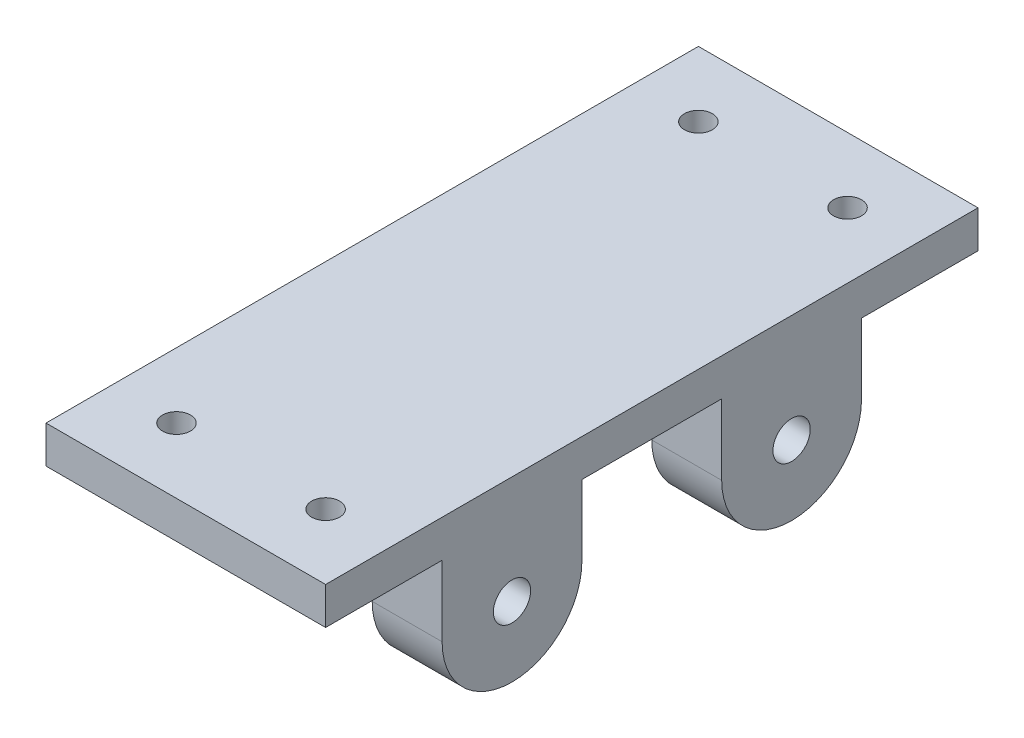
ISO-10303-21;
HEADER;
FILE_DESCRIPTION(('STEP AP214'),'2;1');
FILE_NAME('part.step','',(''),(''),'','','');
FILE_SCHEMA(('AUTOMOTIVE_DESIGN { 1 0 10303 214 1 1 1 1 }'));
ENDSEC;
DATA;
#1=APPLICATION_CONTEXT('core data for automotive mechanical design processes');
#2=APPLICATION_PROTOCOL_DEFINITION('international standard','automotive_design',2000,#1);
#3=PRODUCT_CONTEXT('',#1,'mechanical');
#4=PRODUCT('Part','Part','',(#3));
#5=PRODUCT_RELATED_PRODUCT_CATEGORY('part','',(#4));
#6=PRODUCT_DEFINITION_FORMATION('','',#4);
#7=PRODUCT_DEFINITION_CONTEXT('part definition',#1,'design');
#8=PRODUCT_DEFINITION('design','',#6,#7);
#9=PRODUCT_DEFINITION_SHAPE('','',#8);
#10=(LENGTH_UNIT() NAMED_UNIT(*) SI_UNIT(.MILLI.,.METRE.));
#11=(NAMED_UNIT(*) PLANE_ANGLE_UNIT() SI_UNIT($,.RADIAN.));
#12=(NAMED_UNIT(*) SI_UNIT($,.STERADIAN.) SOLID_ANGLE_UNIT());
#13=UNCERTAINTY_MEASURE_WITH_UNIT(LENGTH_MEASURE(1.E-05),#10,'distance_accuracy_value','');
#14=(GEOMETRIC_REPRESENTATION_CONTEXT(3) GLOBAL_UNCERTAINTY_ASSIGNED_CONTEXT((#13)) GLOBAL_UNIT_ASSIGNED_CONTEXT((#10,
#11,#12)) REPRESENTATION_CONTEXT('',''));
#15=CARTESIAN_POINT('',(0.,0.,0.));
#16=DIRECTION('',(0.,0.,1.));
#17=DIRECTION('',(1.,0.,0.));
#18=AXIS2_PLACEMENT_3D('',#15,#16,#17);
#19=CARTESIAN_POINT('',(-72.5298449772912,-15.1461061132681,-30.));
#20=DIRECTION('',(1.,0.,0.));
#21=DIRECTION('',(0.,0.,-1.));
#22=AXIS2_PLACEMENT_3D('',#19,#20,#21);
#23=CYLINDRICAL_SURFACE('',#22,15.);
#24=CARTESIAN_POINT('',(15.,-15.1461061132681,-30.));
#25=DIRECTION('',(1.,0.,0.));
#26=DIRECTION('',(0.,1.,0.));
#27=AXIS2_PLACEMENT_3D('',#24,#25,#26);
#28=CIRCLE('',#27,15.);
#29=CARTESIAN_POINT('',(15.,-15.1461061132681,-45.));
#30=VERTEX_POINT('',#29);
#31=CARTESIAN_POINT('',(15.,-15.1461061132681,-15.));
#32=VERTEX_POINT('',#31);
#33=EDGE_CURVE('E176',#30,#32,#28,.F.);
#34=ORIENTED_EDGE('',*,*,#33,.F.);
#35=DIRECTION('',(1.,0.,0.));
#36=VECTOR('',#35,1.);
#37=CARTESIAN_POINT('',(-72.5298449772912,-15.1461061132681,-45.));
#38=LINE('',#37,#36);
#39=CARTESIAN_POINT('',(30.,-15.1461061132681,-45.));
#40=VERTEX_POINT('',#39);
#41=EDGE_CURVE('E210',#30,#40,#38,.T.);
#42=ORIENTED_EDGE('',*,*,#41,.T.);
#43=CARTESIAN_POINT('',(30.,-15.1461061132681,-30.));
#44=DIRECTION('',(1.,0.,0.));
#45=DIRECTION('',(0.,0.,-1.));
#46=AXIS2_PLACEMENT_3D('',#43,#44,#45);
#47=CIRCLE('',#46,15.);
#48=CARTESIAN_POINT('',(30.,-15.1461061132681,-15.));
#49=VERTEX_POINT('',#48);
#50=EDGE_CURVE('E308',#49,#40,#47,.T.);
#51=ORIENTED_EDGE('',*,*,#50,.F.);
#52=DIRECTION('',(1.,0.,0.));
#53=VECTOR('',#52,1.);
#54=CARTESIAN_POINT('',(-72.5298449772912,-15.1461061132681,-15.));
#55=LINE('',#54,#53);
#56=EDGE_CURVE('E200',#32,#49,#55,.T.);
#57=ORIENTED_EDGE('',*,*,#56,.F.);
#58=EDGE_LOOP('',(#34,#42,#51,#57));
#59=FACE_BOUND('',#58,.T.);
#60=ADVANCED_FACE('F33',(#59),#23,.T.);
#61=CARTESIAN_POINT('',(-72.5298449772912,-15.1461061132681,-15.));
#62=DIRECTION('',(0.,0.,1.));
#63=DIRECTION('',(1.,0.,0.));
#64=AXIS2_PLACEMENT_3D('',#61,#62,#63);
#65=PLANE('',#64);
#66=DIRECTION('',(0.,-1.,0.));
#67=VECTOR('',#66,1.);
#68=CARTESIAN_POINT('',(-15.,-15.146106113268,-15.));
#69=LINE('',#68,#67);
#70=CARTESIAN_POINT('',(-15.,0.,-15.));
#71=VERTEX_POINT('',#70);
#72=CARTESIAN_POINT('',(-15.,-15.1461061132681,-15.));
#73=VERTEX_POINT('',#72);
#74=EDGE_CURVE('E287',#71,#73,#69,.T.);
#75=ORIENTED_EDGE('',*,*,#74,.F.);
#76=DIRECTION('',(1.,0.,0.));
#77=VECTOR('',#76,1.);
#78=CARTESIAN_POINT('',(-72.5298449772912,0.,-15.));
#79=LINE('',#78,#77);
#80=CARTESIAN_POINT('',(-30.,0.,-15.));
#81=VERTEX_POINT('',#80);
#82=EDGE_CURVE('E196',#81,#71,#79,.T.);
#83=ORIENTED_EDGE('',*,*,#82,.F.);
#84=DIRECTION('',(0.,1.,0.));
#85=VECTOR('',#84,1.);
#86=CARTESIAN_POINT('',(-30.,-15.1461061132681,-15.));
#87=LINE('',#86,#85);
#88=CARTESIAN_POINT('',(-30.,-15.1461061132681,-15.));
#89=VERTEX_POINT('',#88);
#90=EDGE_CURVE('E332',#89,#81,#87,.T.);
#91=ORIENTED_EDGE('',*,*,#90,.F.);
#92=EDGE_CURVE('E204',#89,#73,#55,.T.);
#93=ORIENTED_EDGE('',*,*,#92,.T.);
#94=EDGE_LOOP('',(#75,#83,#91,#93));
#95=FACE_BOUND('',#94,.T.);
#96=ADVANCED_FACE('F366',(#95),#65,.T.);
#97=CARTESIAN_POINT('',(-72.5298449772912,0.,-45.));
#98=DIRECTION('',(0.,0.,-1.));
#99=DIRECTION('',(-1.,0.,0.));
#100=AXIS2_PLACEMENT_3D('',#97,#98,#99);
#101=PLANE('',#100);
#102=DIRECTION('',(0.,1.,0.));
#103=VECTOR('',#102,1.);
#104=CARTESIAN_POINT('',(-15.,0.,-45.));
#105=LINE('',#104,#103);
#106=CARTESIAN_POINT('',(-15.,-15.1461061132681,-45.));
#107=VERTEX_POINT('',#106);
#108=CARTESIAN_POINT('',(-15.,0.,-45.));
#109=VERTEX_POINT('',#108);
#110=EDGE_CURVE('E283',#107,#109,#105,.T.);
#111=ORIENTED_EDGE('',*,*,#110,.F.);
#112=CARTESIAN_POINT('',(-30.,-15.1461061132681,-45.));
#113=VERTEX_POINT('',#112);
#114=EDGE_CURVE('E207',#113,#107,#38,.T.);
#115=ORIENTED_EDGE('',*,*,#114,.F.);
#116=DIRECTION('',(0.,-1.,0.));
#117=VECTOR('',#116,1.);
#118=CARTESIAN_POINT('',(-30.,0.,-45.));
#119=LINE('',#118,#117);
#120=CARTESIAN_POINT('',(-30.,0.,-45.));
#121=VERTEX_POINT('',#120);
#122=EDGE_CURVE('E211',#121,#113,#119,.T.);
#123=ORIENTED_EDGE('',*,*,#122,.F.);
#124=DIRECTION('',(1.,0.,0.));
#125=VECTOR('',#124,1.);
#126=CARTESIAN_POINT('',(-72.5298449772912,0.,-45.));
#127=LINE('',#126,#125);
#128=EDGE_CURVE('E197',#121,#109,#127,.T.);
#129=ORIENTED_EDGE('',*,*,#128,.T.);
#130=EDGE_LOOP('',(#111,#115,#123,#129));
#131=FACE_BOUND('',#130,.T.);
#132=ADVANCED_FACE('F372',(#131),#101,.T.);
#133=CARTESIAN_POINT('',(-72.5298449772912,-15.1461061132681,15.));
#134=DIRECTION('',(0.,0.,1.));
#135=DIRECTION('',(1.,0.,0.));
#136=AXIS2_PLACEMENT_3D('',#133,#134,#135);
#137=PLANE('',#136);
#138=DIRECTION('',(1.,0.,0.));
#139=VECTOR('',#138,1.);
#140=CARTESIAN_POINT('',(-72.5298449772912,0.,15.));
#141=LINE('',#140,#139);
#142=CARTESIAN_POINT('',(-30.,0.,15.));
#143=VERTEX_POINT('',#142);
#144=CARTESIAN_POINT('',(-15.,0.,15.));
#145=VERTEX_POINT('',#144);
#146=EDGE_CURVE('E324',#143,#145,#141,.T.);
#147=ORIENTED_EDGE('',*,*,#146,.T.);
#148=DIRECTION('',(0.,-1.,0.));
#149=VECTOR('',#148,1.);
#150=CARTESIAN_POINT('',(-15.,-15.146106113268,15.));
#151=LINE('',#150,#149);
#152=CARTESIAN_POINT('',(-15.,-15.1461061132681,15.));
#153=VERTEX_POINT('',#152);
#154=EDGE_CURVE('E280',#145,#153,#151,.T.);
#155=ORIENTED_EDGE('',*,*,#154,.T.);
#156=DIRECTION('',(1.,0.,0.));
#157=VECTOR('',#156,1.);
#158=CARTESIAN_POINT('',(-72.5298449772912,-15.1461061132681,15.));
#159=LINE('',#158,#157);
#160=CARTESIAN_POINT('',(-30.,-15.1461061132681,15.));
#161=VERTEX_POINT('',#160);
#162=EDGE_CURVE('E328',#161,#153,#159,.T.);
#163=ORIENTED_EDGE('',*,*,#162,.F.);
#164=DIRECTION('',(0.,1.,0.));
#165=VECTOR('',#164,1.);
#166=CARTESIAN_POINT('',(-30.,-15.1461061132681,15.));
#167=LINE('',#166,#165);
#168=EDGE_CURVE('E305',#161,#143,#167,.T.);
#169=ORIENTED_EDGE('',*,*,#168,.T.);
#170=EDGE_LOOP('',(#147,#155,#163,#169));
#171=FACE_BOUND('',#170,.T.);
#172=ADVANCED_FACE('F438',(#171),#137,.F.);
#173=CARTESIAN_POINT('',(-72.5298449772912,0.,45.));
#174=DIRECTION('',(0.,0.,-1.));
#175=DIRECTION('',(-1.,0.,0.));
#176=AXIS2_PLACEMENT_3D('',#173,#174,#175);
#177=PLANE('',#176);
#178=DIRECTION('',(1.,0.,0.));
#179=VECTOR('',#178,1.);
#180=CARTESIAN_POINT('',(-72.5298449772912,-15.1461061132681,45.));
#181=LINE('',#180,#179);
#182=CARTESIAN_POINT('',(-30.,-15.1461061132681,45.));
#183=VERTEX_POINT('',#182);
#184=CARTESIAN_POINT('',(-15.,-15.1461061132681,45.));
#185=VERTEX_POINT('',#184);
#186=EDGE_CURVE('E318',#183,#185,#181,.T.);
#187=ORIENTED_EDGE('',*,*,#186,.T.);
#188=DIRECTION('',(0.,1.,0.));
#189=VECTOR('',#188,1.);
#190=CARTESIAN_POINT('',(-15.,0.,45.));
#191=LINE('',#190,#189);
#192=CARTESIAN_POINT('',(-15.,0.,45.));
#193=VERTEX_POINT('',#192);
#194=EDGE_CURVE('E278',#185,#193,#191,.T.);
#195=ORIENTED_EDGE('',*,*,#194,.T.);
#196=DIRECTION('',(1.,0.,0.));
#197=VECTOR('',#196,1.);
#198=CARTESIAN_POINT('',(-72.5298449772912,0.,45.));
#199=LINE('',#198,#197);
#200=CARTESIAN_POINT('',(-30.,0.,45.));
#201=VERTEX_POINT('',#200);
#202=EDGE_CURVE('E58',#201,#193,#199,.T.);
#203=ORIENTED_EDGE('',*,*,#202,.F.);
#204=DIRECTION('',(0.,-1.,0.));
#205=VECTOR('',#204,1.);
#206=CARTESIAN_POINT('',(-30.,0.,45.));
#207=LINE('',#206,#205);
#208=EDGE_CURVE('E302',#201,#183,#207,.T.);
#209=ORIENTED_EDGE('',*,*,#208,.T.);
#210=EDGE_LOOP('',(#187,#195,#203,#209));
#211=FACE_BOUND('',#210,.T.);
#212=ADVANCED_FACE('F429',(#211),#177,.F.);
#213=CARTESIAN_POINT('',(-72.5298449772912,-15.1461061132681,30.));
#214=DIRECTION('',(1.,0.,0.));
#215=DIRECTION('',(0.,0.,-1.));
#216=AXIS2_PLACEMENT_3D('',#213,#214,#215);
#217=CYLINDRICAL_SURFACE('',#216,15.);
#218=CARTESIAN_POINT('',(15.,-15.1461061132681,45.));
#219=VERTEX_POINT('',#218);
#220=CARTESIAN_POINT('',(30.,-15.1461061132681,45.));
#221=VERTEX_POINT('',#220);
#222=EDGE_CURVE('E321',#219,#221,#181,.T.);
#223=ORIENTED_EDGE('',*,*,#222,.F.);
#224=CARTESIAN_POINT('',(15.,-15.1461061132681,30.));
#225=DIRECTION('',(1.,0.,0.));
#226=DIRECTION('',(0.,1.,0.));
#227=AXIS2_PLACEMENT_3D('',#224,#225,#226);
#228=CIRCLE('',#227,15.);
#229=CARTESIAN_POINT('',(15.,-15.1461061132681,15.));
#230=VERTEX_POINT('',#229);
#231=EDGE_CURVE('E251',#219,#230,#228,.T.);
#232=ORIENTED_EDGE('',*,*,#231,.T.);
#233=CARTESIAN_POINT('',(30.,-15.1461061132681,15.));
#234=VERTEX_POINT('',#233);
#235=EDGE_CURVE('E317',#230,#234,#159,.T.);
#236=ORIENTED_EDGE('',*,*,#235,.T.);
#237=CARTESIAN_POINT('',(30.,-15.1461061132681,30.));
#238=DIRECTION('',(-1.,0.,0.));
#239=DIRECTION('',(0.,0.,1.));
#240=AXIS2_PLACEMENT_3D('',#237,#238,#239);
#241=CIRCLE('',#240,15.);
#242=EDGE_CURVE('E297',#234,#221,#241,.T.);
#243=ORIENTED_EDGE('',*,*,#242,.T.);
#244=EDGE_LOOP('',(#223,#232,#236,#243));
#245=FACE_BOUND('',#244,.T.);
#246=ADVANCED_FACE('F418',(#245),#217,.T.);
#247=CARTESIAN_POINT('',(-30.001,-15.1461061132681,30.));
#248=DIRECTION('',(1.,0.,0.));
#249=DIRECTION('',(0.,0.,-1.));
#250=AXIS2_PLACEMENT_3D('',#247,#248,#249);
#251=CYLINDRICAL_SURFACE('',#250,4.00000000000001);
#252=CARTESIAN_POINT('',(-15.,-15.1461061132681,30.));
#253=DIRECTION('',(-1.,0.,0.));
#254=DIRECTION('',(0.,-1.,0.));
#255=AXIS2_PLACEMENT_3D('',#252,#253,#254);
#256=CIRCLE('',#255,4.00000000000001);
#257=CARTESIAN_POINT('',(-15.,-19.1461061132681,30.));
#258=VERTEX_POINT('',#257);
#259=EDGE_CURVE('E273',#258,#258,#256,.F.);
#260=ORIENTED_EDGE('',*,*,#259,.T.);
#261=EDGE_LOOP('',(#260));
#262=FACE_BOUND('',#261,.T.);
#263=CARTESIAN_POINT('',(-30.,-15.1461061132681,30.));
#264=DIRECTION('',(1.,0.,0.));
#265=DIRECTION('',(0.,0.,-1.));
#266=AXIS2_PLACEMENT_3D('',#263,#264,#265);
#267=CIRCLE('',#266,4.00000000000001);
#268=CARTESIAN_POINT('',(-30.,-15.1461061132681,26.));
#269=VERTEX_POINT('',#268);
#270=EDGE_CURVE('E294',#269,#269,#267,.F.);
#271=ORIENTED_EDGE('',*,*,#270,.T.);
#272=EDGE_LOOP('',(#271));
#273=FACE_BOUND('',#272,.T.);
#274=ADVANCED_FACE('F359',(#262,#273),#251,.F.);
#275=CARTESIAN_POINT('',(-30.001,-15.1461061132681,-30.));
#276=DIRECTION('',(1.,0.,0.));
#277=DIRECTION('',(0.,0.,-1.));
#278=AXIS2_PLACEMENT_3D('',#275,#276,#277);
#279=CYLINDRICAL_SURFACE('',#278,3.99999999999999);
#280=CARTESIAN_POINT('',(-15.,-15.1461061132681,-30.));
#281=DIRECTION('',(-1.,0.,0.));
#282=DIRECTION('',(0.,-1.,0.));
#283=AXIS2_PLACEMENT_3D('',#280,#281,#282);
#284=CIRCLE('',#283,3.99999999999999);
#285=CARTESIAN_POINT('',(-15.,-19.146106113268,-30.));
#286=VERTEX_POINT('',#285);
#287=EDGE_CURVE('E37',#286,#286,#284,.F.);
#288=ORIENTED_EDGE('',*,*,#287,.T.);
#289=EDGE_LOOP('',(#288));
#290=FACE_BOUND('',#289,.T.);
#291=CARTESIAN_POINT('',(-30.,-15.1461061132681,-30.));
#292=DIRECTION('',(1.,0.,0.));
#293=DIRECTION('',(0.,0.,-1.));
#294=AXIS2_PLACEMENT_3D('',#291,#292,#293);
#295=CIRCLE('',#294,3.99999999999999);
#296=CARTESIAN_POINT('',(-30.,-15.1461061132681,-34.));
#297=VERTEX_POINT('',#296);
#298=EDGE_CURVE('E293',#297,#297,#295,.F.);
#299=ORIENTED_EDGE('',*,*,#298,.T.);
#300=EDGE_LOOP('',(#299));
#301=FACE_BOUND('',#300,.T.);
#302=ADVANCED_FACE('F351',(#290,#301),#279,.F.);
#303=CARTESIAN_POINT('',(30.,8.,70.));
#304=DIRECTION('',(-1.,0.,0.));
#305=DIRECTION('',(0.,0.,1.));
#306=AXIS2_PLACEMENT_3D('',#303,#304,#305);
#307=PLANE('',#306);
#308=CARTESIAN_POINT('',(30.,-15.1461061132681,-30.));
#309=DIRECTION('',(1.,0.,0.));
#310=DIRECTION('',(0.,0.,-1.));
#311=AXIS2_PLACEMENT_3D('',#308,#309,#310);
#312=CIRCLE('',#311,3.99999999999999);
#313=CARTESIAN_POINT('',(30.,-15.1461061132681,-34.));
#314=VERTEX_POINT('',#313);
#315=EDGE_CURVE('E290',#314,#314,#312,.T.);
#316=ORIENTED_EDGE('',*,*,#315,.F.);
#317=EDGE_LOOP('',(#316));
#318=FACE_BOUND('',#317,.T.);
#319=CARTESIAN_POINT('',(30.,-15.1461061132681,30.));
#320=DIRECTION('',(1.,0.,0.));
#321=DIRECTION('',(0.,0.,-1.));
#322=AXIS2_PLACEMENT_3D('',#319,#320,#321);
#323=CIRCLE('',#322,4.00000000000001);
#324=CARTESIAN_POINT('',(30.,-15.1461061132681,26.));
#325=VERTEX_POINT('',#324);
#326=EDGE_CURVE('E289',#325,#325,#323,.T.);
#327=ORIENTED_EDGE('',*,*,#326,.F.);
#328=EDGE_LOOP('',(#327));
#329=FACE_BOUND('',#328,.T.);
#330=DIRECTION('',(0.,0.,-1.));
#331=VECTOR('',#330,1.);
#332=CARTESIAN_POINT('',(30.,0.,70.));
#333=LINE('',#332,#331);
#334=CARTESIAN_POINT('',(30.,0.,70.));
#335=VERTEX_POINT('',#334);
#336=CARTESIAN_POINT('',(30.,0.,45.));
#337=VERTEX_POINT('',#336);
#338=EDGE_CURVE('E226',#335,#337,#333,.T.);
#339=ORIENTED_EDGE('',*,*,#338,.T.);
#340=DIRECTION('',(0.,1.,0.));
#341=VECTOR('',#340,1.);
#342=CARTESIAN_POINT('',(30.,0.,45.));
#343=LINE('',#342,#341);
#344=EDGE_CURVE('E314',#221,#337,#343,.T.);
#345=ORIENTED_EDGE('',*,*,#344,.F.);
#346=ORIENTED_EDGE('',*,*,#242,.F.);
#347=DIRECTION('',(0.,-1.,0.));
#348=VECTOR('',#347,1.);
#349=CARTESIAN_POINT('',(30.,-15.1461061132681,15.));
#350=LINE('',#349,#348);
#351=CARTESIAN_POINT('',(30.,0.,15.));
#352=VERTEX_POINT('',#351);
#353=EDGE_CURVE('E311',#352,#234,#350,.T.);
#354=ORIENTED_EDGE('',*,*,#353,.F.);
#355=CARTESIAN_POINT('',(30.,0.,-15.));
#356=VERTEX_POINT('',#355);
#357=EDGE_CURVE('E230',#352,#356,#333,.T.);
#358=ORIENTED_EDGE('',*,*,#357,.T.);
#359=DIRECTION('',(0.,-1.,0.));
#360=VECTOR('',#359,1.);
#361=CARTESIAN_POINT('',(30.,-15.1461061132681,-15.));
#362=LINE('',#361,#360);
#363=EDGE_CURVE('E195',#356,#49,#362,.T.);
#364=ORIENTED_EDGE('',*,*,#363,.T.);
#365=ORIENTED_EDGE('',*,*,#50,.T.);
#366=DIRECTION('',(0.,1.,0.));
#367=VECTOR('',#366,1.);
#368=CARTESIAN_POINT('',(30.,0.,-45.));
#369=LINE('',#368,#367);
#370=CARTESIAN_POINT('',(30.,0.,-45.));
#371=VERTEX_POINT('',#370);
#372=EDGE_CURVE('E338',#40,#371,#369,.T.);
#373=ORIENTED_EDGE('',*,*,#372,.T.);
#374=CARTESIAN_POINT('',(30.,0.,-70.));
#375=VERTEX_POINT('',#374);
#376=EDGE_CURVE('E213',#371,#375,#333,.T.);
#377=ORIENTED_EDGE('',*,*,#376,.T.);
#378=DIRECTION('',(0.,-1.,0.));
#379=VECTOR('',#378,1.);
#380=CARTESIAN_POINT('',(30.,8.,-70.));
#381=LINE('',#380,#379);
#382=CARTESIAN_POINT('',(30.,8.,-70.));
#383=VERTEX_POINT('',#382);
#384=EDGE_CURVE('E11',#383,#375,#381,.T.);
#385=ORIENTED_EDGE('',*,*,#384,.F.);
#386=DIRECTION('',(0.,0.,-1.));
#387=VECTOR('',#386,1.);
#388=CARTESIAN_POINT('',(30.,8.,70.));
#389=LINE('',#388,#387);
#390=CARTESIAN_POINT('',(30.,8.,70.));
#391=VERTEX_POINT('',#390);
#392=EDGE_CURVE('E215',#391,#383,#389,.T.);
#393=ORIENTED_EDGE('',*,*,#392,.F.);
#394=DIRECTION('',(0.,-1.,0.));
#395=VECTOR('',#394,1.);
#396=CARTESIAN_POINT('',(30.,8.,70.));
#397=LINE('',#396,#395);
#398=EDGE_CURVE('E225',#391,#335,#397,.T.);
#399=ORIENTED_EDGE('',*,*,#398,.T.);
#400=EDGE_LOOP('',(#339,#345,#346,#354,#358,#364,#365,#373,#377,#385,#393,#399));
#401=FACE_BOUND('',#400,.T.);
#402=ADVANCED_FACE('F35',(#318,#329,#401),#307,.F.);
#403=CARTESIAN_POINT('',(-30.,8.,-70.));
#404=DIRECTION('',(0.,0.,1.));
#405=DIRECTION('',(1.,0.,0.));
#406=AXIS2_PLACEMENT_3D('',#403,#404,#405);
#407=PLANE('',#406);
#408=DIRECTION('',(-1.,0.,0.));
#409=VECTOR('',#408,1.);
#410=CARTESIAN_POINT('',(-30.,0.,-70.));
#411=LINE('',#410,#409);
#412=CARTESIAN_POINT('',(-30.,0.,-70.));
#413=VERTEX_POINT('',#412);
#414=EDGE_CURVE('E229',#375,#413,#411,.T.);
#415=ORIENTED_EDGE('',*,*,#414,.T.);
#416=DIRECTION('',(0.,-1.,0.));
#417=VECTOR('',#416,1.);
#418=CARTESIAN_POINT('',(-30.,8.,-70.));
#419=LINE('',#418,#417);
#420=CARTESIAN_POINT('',(-30.,8.,-70.));
#421=VERTEX_POINT('',#420);
#422=EDGE_CURVE('E42',#421,#413,#419,.T.);
#423=ORIENTED_EDGE('',*,*,#422,.F.);
#424=DIRECTION('',(-1.,0.,0.));
#425=VECTOR('',#424,1.);
#426=CARTESIAN_POINT('',(-30.,8.,-70.));
#427=LINE('',#426,#425);
#428=EDGE_CURVE('E218',#383,#421,#427,.T.);
#429=ORIENTED_EDGE('',*,*,#428,.F.);
#430=ORIENTED_EDGE('',*,*,#384,.T.);
#431=EDGE_LOOP('',(#415,#423,#429,#430));
#432=FACE_BOUND('',#431,.T.);
#433=ADVANCED_FACE('F350',(#432),#407,.F.);
#434=CARTESIAN_POINT('',(-30.,8.,70.));
#435=DIRECTION('',(1.,0.,0.));
#436=DIRECTION('',(0.,0.,-1.));
#437=AXIS2_PLACEMENT_3D('',#434,#435,#436);
#438=PLANE('',#437);
#439=ORIENTED_EDGE('',*,*,#298,.F.);
#440=EDGE_LOOP('',(#439));
#441=FACE_BOUND('',#440,.T.);
#442=ORIENTED_EDGE('',*,*,#270,.F.);
#443=EDGE_LOOP('',(#442));
#444=FACE_BOUND('',#443,.T.);
#445=DIRECTION('',(0.,0.,1.));
#446=VECTOR('',#445,1.);
#447=CARTESIAN_POINT('',(-30.,0.,70.));
#448=LINE('',#447,#446);
#449=EDGE_CURVE('E233',#413,#121,#448,.T.);
#450=ORIENTED_EDGE('',*,*,#449,.T.);
#451=ORIENTED_EDGE('',*,*,#122,.T.);
#452=CARTESIAN_POINT('',(-30.,-15.1461061132681,-30.));
#453=DIRECTION('',(1.,0.,0.));
#454=DIRECTION('',(0.,0.,-1.));
#455=AXIS2_PLACEMENT_3D('',#452,#453,#454);
#456=CIRCLE('',#455,15.);
#457=EDGE_CURVE('E214',#113,#89,#456,.F.);
#458=ORIENTED_EDGE('',*,*,#457,.T.);
#459=ORIENTED_EDGE('',*,*,#90,.T.);
#460=EDGE_CURVE('E236',#81,#143,#448,.T.);
#461=ORIENTED_EDGE('',*,*,#460,.T.);
#462=ORIENTED_EDGE('',*,*,#168,.F.);
#463=CARTESIAN_POINT('',(-30.,-15.1461061132681,30.));
#464=DIRECTION('',(1.,0.,0.));
#465=DIRECTION('',(0.,0.,-1.));
#466=AXIS2_PLACEMENT_3D('',#463,#464,#465);
#467=CIRCLE('',#466,15.);
#468=EDGE_CURVE('E304',#183,#161,#467,.T.);
#469=ORIENTED_EDGE('',*,*,#468,.F.);
#470=ORIENTED_EDGE('',*,*,#208,.F.);
#471=CARTESIAN_POINT('',(-30.,0.,70.));
#472=VERTEX_POINT('',#471);
#473=EDGE_CURVE('E232',#201,#472,#448,.T.);
#474=ORIENTED_EDGE('',*,*,#473,.T.);
#475=DIRECTION('',(0.,-1.,0.));
#476=VECTOR('',#475,1.);
#477=CARTESIAN_POINT('',(-30.,8.,70.));
#478=LINE('',#477,#476);
#479=CARTESIAN_POINT('',(-30.,8.,70.));
#480=VERTEX_POINT('',#479);
#481=EDGE_CURVE('E240',#480,#472,#478,.T.);
#482=ORIENTED_EDGE('',*,*,#481,.F.);
#483=DIRECTION('',(0.,0.,1.));
#484=VECTOR('',#483,1.);
#485=CARTESIAN_POINT('',(-30.,8.,70.));
#486=LINE('',#485,#484);
#487=EDGE_CURVE('E221',#421,#480,#486,.T.);
#488=ORIENTED_EDGE('',*,*,#487,.F.);
#489=ORIENTED_EDGE('',*,*,#422,.T.);
#490=EDGE_LOOP('',(#450,#451,#458,#459,#461,#462,#469,#470,#474,#482,#488,#489));
#491=FACE_BOUND('',#490,.T.);
#492=ADVANCED_FACE('F357',(#441,#444,#491),#438,.F.);
#493=CARTESIAN_POINT('',(-30.,8.,70.));
#494=DIRECTION('',(0.,0.,-1.));
#495=DIRECTION('',(-1.,0.,0.));
#496=AXIS2_PLACEMENT_3D('',#493,#494,#495);
#497=PLANE('',#496);
#498=DIRECTION('',(1.,0.,0.));
#499=VECTOR('',#498,1.);
#500=CARTESIAN_POINT('',(-30.,0.,70.));
#501=LINE('',#500,#499);
#502=EDGE_CURVE('E219',#472,#335,#501,.T.);
#503=ORIENTED_EDGE('',*,*,#502,.T.);
#504=ORIENTED_EDGE('',*,*,#398,.F.);
#505=DIRECTION('',(1.,0.,0.));
#506=VECTOR('',#505,1.);
#507=CARTESIAN_POINT('',(-30.,8.,70.));
#508=LINE('',#507,#506);
#509=EDGE_CURVE('E223',#480,#391,#508,.T.);
#510=ORIENTED_EDGE('',*,*,#509,.F.);
#511=ORIENTED_EDGE('',*,*,#481,.T.);
#512=EDGE_LOOP('',(#503,#504,#510,#511));
#513=FACE_BOUND('',#512,.T.);
#514=ADVANCED_FACE('F425',(#513),#497,.F.);
#515=CARTESIAN_POINT('',(0.,8.,0.));
#516=DIRECTION('',(0.,-1.,0.));
#517=DIRECTION('',(0.,0.,-1.));
#518=AXIS2_PLACEMENT_3D('',#515,#516,#517);
#519=PLANE('',#518);
#520=CARTESIAN_POINT('',(16.,8.,-56.));
#521=DIRECTION('',(0.,-1.,0.));
#522=DIRECTION('',(0.,0.,-1.));
#523=AXIS2_PLACEMENT_3D('',#520,#521,#522);
#524=CIRCLE('',#523,3.);
#525=CARTESIAN_POINT('',(16.,8.,-59.));
#526=VERTEX_POINT('',#525);
#527=EDGE_CURVE('E258',#526,#526,#524,.T.);
#528=ORIENTED_EDGE('',*,*,#527,.T.);
#529=EDGE_LOOP('',(#528));
#530=FACE_BOUND('',#529,.T.);
#531=CARTESIAN_POINT('',(16.,8.,56.));
#532=DIRECTION('',(0.,-1.,0.));
#533=DIRECTION('',(0.,0.,-1.));
#534=AXIS2_PLACEMENT_3D('',#531,#532,#533);
#535=CIRCLE('',#534,3.);
#536=CARTESIAN_POINT('',(16.,8.,53.));
#537=VERTEX_POINT('',#536);
#538=EDGE_CURVE('E502',#537,#537,#535,.T.);
#539=ORIENTED_EDGE('',*,*,#538,.T.);
#540=EDGE_LOOP('',(#539));
#541=FACE_BOUND('',#540,.T.);
#542=CARTESIAN_POINT('',(-16.,8.,56.));
#543=DIRECTION('',(0.,-1.,0.));
#544=DIRECTION('',(0.,0.,-1.));
#545=AXIS2_PLACEMENT_3D('',#542,#543,#544);
#546=CIRCLE('',#545,3.);
#547=CARTESIAN_POINT('',(-16.,8.,53.));
#548=VERTEX_POINT('',#547);
#549=EDGE_CURVE('E500',#548,#548,#546,.T.);
#550=ORIENTED_EDGE('',*,*,#549,.T.);
#551=EDGE_LOOP('',(#550));
#552=FACE_BOUND('',#551,.T.);
#553=CARTESIAN_POINT('',(-16.,8.,-56.));
#554=DIRECTION('',(0.,-1.,0.));
#555=DIRECTION('',(0.,0.,-1.));
#556=AXIS2_PLACEMENT_3D('',#553,#554,#555);
#557=CIRCLE('',#556,3.);
#558=CARTESIAN_POINT('',(-16.,8.,-59.));
#559=VERTEX_POINT('',#558);
#560=EDGE_CURVE('E503',#559,#559,#557,.T.);
#561=ORIENTED_EDGE('',*,*,#560,.T.);
#562=EDGE_LOOP('',(#561));
#563=FACE_BOUND('',#562,.T.);
#564=ORIENTED_EDGE('',*,*,#392,.T.);
#565=ORIENTED_EDGE('',*,*,#428,.T.);
#566=ORIENTED_EDGE('',*,*,#487,.T.);
#567=ORIENTED_EDGE('',*,*,#509,.T.);
#568=EDGE_LOOP('',(#564,#565,#566,#567));
#569=FACE_BOUND('',#568,.T.);
#570=ADVANCED_FACE('F383',(#530,#541,#552,#563,#569),#519,.F.);
#571=CARTESIAN_POINT('',(0.,0.,0.));
#572=DIRECTION('',(0.,-1.,0.));
#573=DIRECTION('',(0.,0.,-1.));
#574=AXIS2_PLACEMENT_3D('',#571,#572,#573);
#575=PLANE('',#574);
#576=CARTESIAN_POINT('',(16.,0.,-56.));
#577=DIRECTION('',(0.,-1.,0.));
#578=DIRECTION('',(0.,0.,1.));
#579=AXIS2_PLACEMENT_3D('',#576,#577,#578);
#580=CIRCLE('',#579,3.);
#581=CARTESIAN_POINT('',(16.,0.,-53.));
#582=VERTEX_POINT('',#581);
#583=EDGE_CURVE('E512',#582,#582,#580,.T.);
#584=ORIENTED_EDGE('',*,*,#583,.F.);
#585=EDGE_LOOP('',(#584));
#586=FACE_BOUND('',#585,.T.);
#587=CARTESIAN_POINT('',(16.,0.,56.));
#588=DIRECTION('',(0.,-1.,0.));
#589=DIRECTION('',(0.,0.,-1.));
#590=AXIS2_PLACEMENT_3D('',#587,#588,#589);
#591=CIRCLE('',#590,3.);
#592=CARTESIAN_POINT('',(16.,0.,53.));
#593=VERTEX_POINT('',#592);
#594=EDGE_CURVE('E515',#593,#593,#591,.T.);
#595=ORIENTED_EDGE('',*,*,#594,.F.);
#596=EDGE_LOOP('',(#595));
#597=FACE_BOUND('',#596,.T.);
#598=CARTESIAN_POINT('',(-16.,0.,56.));
#599=DIRECTION('',(0.,-1.,0.));
#600=DIRECTION('',(0.,0.,1.));
#601=AXIS2_PLACEMENT_3D('',#598,#599,#600);
#602=CIRCLE('',#601,3.);
#603=CARTESIAN_POINT('',(-16.,0.,59.));
#604=VERTEX_POINT('',#603);
#605=EDGE_CURVE('E497',#604,#604,#602,.T.);
#606=ORIENTED_EDGE('',*,*,#605,.F.);
#607=EDGE_LOOP('',(#606));
#608=FACE_BOUND('',#607,.T.);
#609=CARTESIAN_POINT('',(-16.,0.,-56.));
#610=DIRECTION('',(0.,-1.,0.));
#611=DIRECTION('',(0.,0.,-1.));
#612=AXIS2_PLACEMENT_3D('',#609,#610,#611);
#613=CIRCLE('',#612,3.);
#614=CARTESIAN_POINT('',(-16.,0.,-59.));
#615=VERTEX_POINT('',#614);
#616=EDGE_CURVE('E507',#615,#615,#613,.T.);
#617=ORIENTED_EDGE('',*,*,#616,.F.);
#618=EDGE_LOOP('',(#617));
#619=FACE_BOUND('',#618,.T.);
#620=CARTESIAN_POINT('',(15.,0.,-45.));
#621=VERTEX_POINT('',#620);
#622=EDGE_CURVE('E188',#621,#371,#127,.T.);
#623=ORIENTED_EDGE('',*,*,#622,.F.);
#624=DIRECTION('',(0.,0.,1.));
#625=VECTOR('',#624,1.);
#626=CARTESIAN_POINT('',(15.,0.,-70.));
#627=LINE('',#626,#625);
#628=CARTESIAN_POINT('',(15.,0.,-15.));
#629=VERTEX_POINT('',#628);
#630=EDGE_CURVE('E50',#621,#629,#627,.T.);
#631=ORIENTED_EDGE('',*,*,#630,.T.);
#632=EDGE_CURVE('E185',#629,#356,#79,.T.);
#633=ORIENTED_EDGE('',*,*,#632,.T.);
#634=ORIENTED_EDGE('',*,*,#357,.F.);
#635=CARTESIAN_POINT('',(15.,0.,15.));
#636=VERTEX_POINT('',#635);
#637=EDGE_CURVE('E327',#636,#352,#141,.T.);
#638=ORIENTED_EDGE('',*,*,#637,.F.);
#639=CARTESIAN_POINT('',(15.,0.,45.));
#640=VERTEX_POINT('',#639);
#641=EDGE_CURVE('E190',#636,#640,#627,.T.);
#642=ORIENTED_EDGE('',*,*,#641,.T.);
#643=EDGE_CURVE('E323',#640,#337,#199,.T.);
#644=ORIENTED_EDGE('',*,*,#643,.T.);
#645=ORIENTED_EDGE('',*,*,#338,.F.);
#646=ORIENTED_EDGE('',*,*,#502,.F.);
#647=ORIENTED_EDGE('',*,*,#473,.F.);
#648=ORIENTED_EDGE('',*,*,#202,.T.);
#649=DIRECTION('',(0.,0.,1.));
#650=VECTOR('',#649,1.);
#651=CARTESIAN_POINT('',(-15.,0.,-70.));
#652=LINE('',#651,#650);
#653=EDGE_CURVE('E189',#145,#193,#652,.T.);
#654=ORIENTED_EDGE('',*,*,#653,.F.);
#655=ORIENTED_EDGE('',*,*,#146,.F.);
#656=ORIENTED_EDGE('',*,*,#460,.F.);
#657=ORIENTED_EDGE('',*,*,#82,.T.);
#658=EDGE_CURVE('E247',#109,#71,#652,.T.);
#659=ORIENTED_EDGE('',*,*,#658,.F.);
#660=ORIENTED_EDGE('',*,*,#128,.F.);
#661=ORIENTED_EDGE('',*,*,#449,.F.);
#662=ORIENTED_EDGE('',*,*,#414,.F.);
#663=ORIENTED_EDGE('',*,*,#376,.F.);
#664=EDGE_LOOP('',(#623,#631,#633,#634,#638,#642,#644,#645,#646,#647,#648,#654,#655,#656,#657,
#659,#660,#661,#662,#663));
#665=FACE_BOUND('',#664,.T.);
#666=ADVANCED_FACE('F183',(#586,#597,#608,#619,#665),#575,.T.);
#667=ORIENTED_EDGE('',*,*,#114,.T.);
#668=CARTESIAN_POINT('',(-15.,-15.1461061132681,-30.));
#669=DIRECTION('',(-1.,0.,0.));
#670=DIRECTION('',(0.,-1.,0.));
#671=AXIS2_PLACEMENT_3D('',#668,#669,#670);
#672=CIRCLE('',#671,15.);
#673=EDGE_CURVE('E285',#73,#107,#672,.F.);
#674=ORIENTED_EDGE('',*,*,#673,.F.);
#675=ORIENTED_EDGE('',*,*,#92,.F.);
#676=ORIENTED_EDGE('',*,*,#457,.F.);
#677=EDGE_LOOP('',(#667,#674,#675,#676));
#678=FACE_BOUND('',#677,.T.);
#679=ADVANCED_FACE('F368',(#678),#23,.T.);
#680=DIRECTION('',(0.,1.,0.));
#681=VECTOR('',#680,1.);
#682=CARTESIAN_POINT('',(15.,-15.146106113268,-15.));
#683=LINE('',#682,#681);
#684=EDGE_CURVE('E173',#32,#629,#683,.T.);
#685=ORIENTED_EDGE('',*,*,#684,.F.);
#686=ORIENTED_EDGE('',*,*,#56,.T.);
#687=ORIENTED_EDGE('',*,*,#363,.F.);
#688=ORIENTED_EDGE('',*,*,#632,.F.);
#689=EDGE_LOOP('',(#685,#686,#687,#688));
#690=FACE_BOUND('',#689,.T.);
#691=ADVANCED_FACE('F193',(#690),#65,.T.);
#692=DIRECTION('',(0.,-1.,0.));
#693=VECTOR('',#692,1.);
#694=CARTESIAN_POINT('',(15.,0.,-45.));
#695=LINE('',#694,#693);
#696=EDGE_CURVE('E270',#621,#30,#695,.T.);
#697=ORIENTED_EDGE('',*,*,#696,.F.);
#698=ORIENTED_EDGE('',*,*,#622,.T.);
#699=ORIENTED_EDGE('',*,*,#372,.F.);
#700=ORIENTED_EDGE('',*,*,#41,.F.);
#701=EDGE_LOOP('',(#697,#698,#699,#700));
#702=FACE_BOUND('',#701,.T.);
#703=ADVANCED_FACE('F346',(#702),#101,.T.);
#704=ORIENTED_EDGE('',*,*,#235,.F.);
#705=DIRECTION('',(0.,1.,0.));
#706=VECTOR('',#705,1.);
#707=CARTESIAN_POINT('',(15.,-15.146106113268,15.));
#708=LINE('',#707,#706);
#709=EDGE_CURVE('E267',#230,#636,#708,.T.);
#710=ORIENTED_EDGE('',*,*,#709,.T.);
#711=ORIENTED_EDGE('',*,*,#637,.T.);
#712=ORIENTED_EDGE('',*,*,#353,.T.);
#713=EDGE_LOOP('',(#704,#710,#711,#712));
#714=FACE_BOUND('',#713,.T.);
#715=ADVANCED_FACE('F413',(#714),#137,.F.);
#716=ORIENTED_EDGE('',*,*,#643,.F.);
#717=DIRECTION('',(0.,-1.,0.));
#718=VECTOR('',#717,1.);
#719=CARTESIAN_POINT('',(15.,0.,45.));
#720=LINE('',#719,#718);
#721=EDGE_CURVE('E264',#640,#219,#720,.T.);
#722=ORIENTED_EDGE('',*,*,#721,.T.);
#723=ORIENTED_EDGE('',*,*,#222,.T.);
#724=ORIENTED_EDGE('',*,*,#344,.T.);
#725=EDGE_LOOP('',(#716,#722,#723,#724));
#726=FACE_BOUND('',#725,.T.);
#727=ADVANCED_FACE('F420',(#726),#177,.F.);
#728=CARTESIAN_POINT('',(-15.,-15.1461061132681,30.));
#729=DIRECTION('',(-1.,0.,0.));
#730=DIRECTION('',(0.,-1.,0.));
#731=AXIS2_PLACEMENT_3D('',#728,#729,#730);
#732=CIRCLE('',#731,15.);
#733=EDGE_CURVE('E276',#153,#185,#732,.T.);
#734=ORIENTED_EDGE('',*,*,#733,.T.);
#735=ORIENTED_EDGE('',*,*,#186,.F.);
#736=ORIENTED_EDGE('',*,*,#468,.T.);
#737=ORIENTED_EDGE('',*,*,#162,.T.);
#738=EDGE_LOOP('',(#734,#735,#736,#737));
#739=FACE_BOUND('',#738,.T.);
#740=ADVANCED_FACE('F432',(#739),#217,.T.);
#741=CARTESIAN_POINT('',(15.,-15.1461061132681,30.));
#742=DIRECTION('',(1.,0.,0.));
#743=DIRECTION('',(0.,1.,0.));
#744=AXIS2_PLACEMENT_3D('',#741,#742,#743);
#745=CIRCLE('',#744,4.00000000000001);
#746=CARTESIAN_POINT('',(15.,-11.146106113268,30.));
#747=VERTEX_POINT('',#746);
#748=EDGE_CURVE('E246',#747,#747,#745,.F.);
#749=ORIENTED_EDGE('',*,*,#748,.T.);
#750=EDGE_LOOP('',(#749));
#751=FACE_BOUND('',#750,.T.);
#752=ORIENTED_EDGE('',*,*,#326,.T.);
#753=EDGE_LOOP('',(#752));
#754=FACE_BOUND('',#753,.T.);
#755=ADVANCED_FACE('F455',(#751,#754),#251,.F.);
#756=CARTESIAN_POINT('',(15.,-15.1461061132681,-30.));
#757=DIRECTION('',(1.,0.,0.));
#758=DIRECTION('',(0.,1.,0.));
#759=AXIS2_PLACEMENT_3D('',#756,#757,#758);
#760=CIRCLE('',#759,3.99999999999999);
#761=CARTESIAN_POINT('',(15.,-11.1461061132681,-30.));
#762=VERTEX_POINT('',#761);
#763=EDGE_CURVE('E244',#762,#762,#760,.F.);
#764=ORIENTED_EDGE('',*,*,#763,.T.);
#765=EDGE_LOOP('',(#764));
#766=FACE_BOUND('',#765,.T.);
#767=ORIENTED_EDGE('',*,*,#315,.T.);
#768=EDGE_LOOP('',(#767));
#769=FACE_BOUND('',#768,.T.);
#770=ADVANCED_FACE('F362',(#766,#769),#279,.F.);
#771=CARTESIAN_POINT('',(-15.,0.,-70.));
#772=DIRECTION('',(-1.,0.,0.));
#773=DIRECTION('',(0.,-1.,0.));
#774=AXIS2_PLACEMENT_3D('',#771,#772,#773);
#775=PLANE('',#774);
#776=ORIENTED_EDGE('',*,*,#74,.T.);
#777=ORIENTED_EDGE('',*,*,#673,.T.);
#778=ORIENTED_EDGE('',*,*,#110,.T.);
#779=ORIENTED_EDGE('',*,*,#658,.T.);
#780=EDGE_LOOP('',(#776,#777,#778,#779));
#781=FACE_BOUND('',#780,.T.);
#782=ORIENTED_EDGE('',*,*,#287,.F.);
#783=EDGE_LOOP('',(#782));
#784=FACE_BOUND('',#783,.T.);
#785=ADVANCED_FACE('F394',(#781,#784),#775,.F.);
#786=CARTESIAN_POINT('',(15.,0.,-70.));
#787=DIRECTION('',(1.,0.,0.));
#788=DIRECTION('',(0.,1.,0.));
#789=AXIS2_PLACEMENT_3D('',#786,#787,#788);
#790=PLANE('',#789);
#791=ORIENTED_EDGE('',*,*,#684,.T.);
#792=ORIENTED_EDGE('',*,*,#630,.F.);
#793=ORIENTED_EDGE('',*,*,#696,.T.);
#794=ORIENTED_EDGE('',*,*,#33,.T.);
#795=EDGE_LOOP('',(#791,#792,#793,#794));
#796=FACE_BOUND('',#795,.T.);
#797=ORIENTED_EDGE('',*,*,#763,.F.);
#798=EDGE_LOOP('',(#797));
#799=FACE_BOUND('',#798,.T.);
#800=ADVANCED_FACE('F174',(#796,#799),#790,.F.);
#801=ORIENTED_EDGE('',*,*,#259,.F.);
#802=EDGE_LOOP('',(#801));
#803=FACE_BOUND('',#802,.T.);
#804=ORIENTED_EDGE('',*,*,#653,.T.);
#805=ORIENTED_EDGE('',*,*,#194,.F.);
#806=ORIENTED_EDGE('',*,*,#733,.F.);
#807=ORIENTED_EDGE('',*,*,#154,.F.);
#808=EDGE_LOOP('',(#804,#805,#806,#807));
#809=FACE_BOUND('',#808,.T.);
#810=ADVANCED_FACE('F435',(#803,#809),#775,.F.);
#811=ORIENTED_EDGE('',*,*,#748,.F.);
#812=EDGE_LOOP('',(#811));
#813=FACE_BOUND('',#812,.T.);
#814=ORIENTED_EDGE('',*,*,#231,.F.);
#815=ORIENTED_EDGE('',*,*,#721,.F.);
#816=ORIENTED_EDGE('',*,*,#641,.F.);
#817=ORIENTED_EDGE('',*,*,#709,.F.);
#818=EDGE_LOOP('',(#814,#815,#816,#817));
#819=FACE_BOUND('',#818,.T.);
#820=ADVANCED_FACE('F415',(#813,#819),#790,.F.);
#821=CARTESIAN_POINT('',(-16.,10.,-56.));
#822=DIRECTION('',(0.,-1.,0.));
#823=DIRECTION('',(0.,0.,-1.));
#824=AXIS2_PLACEMENT_3D('',#821,#822,#823);
#825=CYLINDRICAL_SURFACE('',#824,3.);
#826=ORIENTED_EDGE('',*,*,#616,.T.);
#827=EDGE_LOOP('',(#826));
#828=FACE_BOUND('',#827,.T.);
#829=ORIENTED_EDGE('',*,*,#560,.F.);
#830=EDGE_LOOP('',(#829));
#831=FACE_BOUND('',#830,.T.);
#832=ADVANCED_FACE('F476',(#828,#831),#825,.F.);
#833=CARTESIAN_POINT('',(-16.,10.,56.));
#834=DIRECTION('',(0.,-1.,0.));
#835=DIRECTION('',(0.,0.,-1.));
#836=AXIS2_PLACEMENT_3D('',#833,#834,#835);
#837=CYLINDRICAL_SURFACE('',#836,3.);
#838=ORIENTED_EDGE('',*,*,#605,.T.);
#839=EDGE_LOOP('',(#838));
#840=FACE_BOUND('',#839,.T.);
#841=ORIENTED_EDGE('',*,*,#549,.F.);
#842=EDGE_LOOP('',(#841));
#843=FACE_BOUND('',#842,.T.);
#844=ADVANCED_FACE('F480',(#840,#843),#837,.F.);
#845=CARTESIAN_POINT('',(16.,10.,56.));
#846=DIRECTION('',(0.,-1.,0.));
#847=DIRECTION('',(0.,0.,-1.));
#848=AXIS2_PLACEMENT_3D('',#845,#846,#847);
#849=CYLINDRICAL_SURFACE('',#848,3.);
#850=ORIENTED_EDGE('',*,*,#594,.T.);
#851=EDGE_LOOP('',(#850));
#852=FACE_BOUND('',#851,.T.);
#853=ORIENTED_EDGE('',*,*,#538,.F.);
#854=EDGE_LOOP('',(#853));
#855=FACE_BOUND('',#854,.T.);
#856=ADVANCED_FACE('F485',(#852,#855),#849,.F.);
#857=CARTESIAN_POINT('',(16.,10.,-56.));
#858=DIRECTION('',(0.,-1.,0.));
#859=DIRECTION('',(0.,0.,-1.));
#860=AXIS2_PLACEMENT_3D('',#857,#858,#859);
#861=CYLINDRICAL_SURFACE('',#860,3.);
#862=ORIENTED_EDGE('',*,*,#583,.T.);
#863=EDGE_LOOP('',(#862));
#864=FACE_BOUND('',#863,.T.);
#865=ORIENTED_EDGE('',*,*,#527,.F.);
#866=EDGE_LOOP('',(#865));
#867=FACE_BOUND('',#866,.T.);
#868=ADVANCED_FACE('F482',(#864,#867),#861,.F.);
#869=CLOSED_SHELL('',(#60,#96,#132,#172,#212,#246,#274,#302,#402,#433,#492,#514,#570,#666,#679,
#691,#703,#715,#727,#740,#755,#770,#785,#800,#810,#820,#832,#844,#856,#868));
#870=MANIFOLD_SOLID_BREP('B2',#869);
#871=ADVANCED_BREP_SHAPE_REPRESENTATION('',(#18,#870),#14);
#872=SHAPE_DEFINITION_REPRESENTATION(#9,#871);
ENDSEC;
END-ISO-10303-21;
